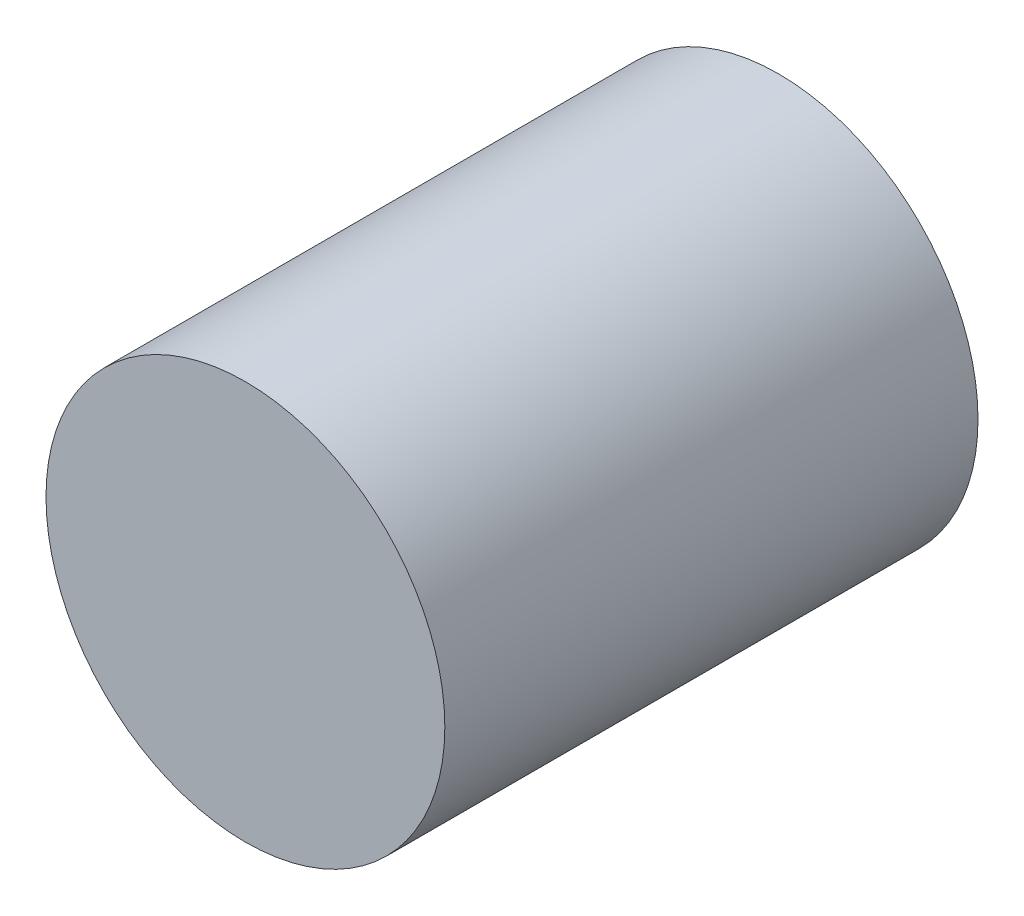
ISO-10303-21;
HEADER;
FILE_DESCRIPTION(('STEP AP214'),'2;1');
FILE_NAME('part.step','',(''),(''),'','','');
FILE_SCHEMA(('AUTOMOTIVE_DESIGN { 1 0 10303 214 1 1 1 1 }'));
ENDSEC;
DATA;
#1=APPLICATION_CONTEXT('core data for automotive mechanical design processes');
#2=APPLICATION_PROTOCOL_DEFINITION('international standard','automotive_design',2000,#1);
#3=PRODUCT_CONTEXT('',#1,'mechanical');
#4=PRODUCT('Part','Part','',(#3));
#5=PRODUCT_RELATED_PRODUCT_CATEGORY('part','',(#4));
#6=PRODUCT_DEFINITION_FORMATION('','',#4);
#7=PRODUCT_DEFINITION_CONTEXT('part definition',#1,'design');
#8=PRODUCT_DEFINITION('design','',#6,#7);
#9=PRODUCT_DEFINITION_SHAPE('','',#8);
#10=(LENGTH_UNIT() NAMED_UNIT(*) SI_UNIT(.MILLI.,.METRE.));
#11=(NAMED_UNIT(*) PLANE_ANGLE_UNIT() SI_UNIT($,.RADIAN.));
#12=(NAMED_UNIT(*) SI_UNIT($,.STERADIAN.) SOLID_ANGLE_UNIT());
#13=UNCERTAINTY_MEASURE_WITH_UNIT(LENGTH_MEASURE(1.E-05),#10,'distance_accuracy_value','');
#14=(GEOMETRIC_REPRESENTATION_CONTEXT(3) GLOBAL_UNCERTAINTY_ASSIGNED_CONTEXT((#13)) GLOBAL_UNIT_ASSIGNED_CONTEXT((#10,
#11,#12)) REPRESENTATION_CONTEXT('',''));
#15=CARTESIAN_POINT('',(0.,0.,0.));
#16=DIRECTION('',(0.,0.,1.));
#17=DIRECTION('',(1.,0.,0.));
#18=AXIS2_PLACEMENT_3D('',#15,#16,#17);
#19=CARTESIAN_POINT('',(0.,0.,12.7));
#20=DIRECTION('',(0.,0.,-1.));
#21=DIRECTION('',(-1.,0.,0.));
#22=AXIS2_PLACEMENT_3D('',#19,#20,#21);
#23=CYLINDRICAL_SURFACE('',#22,4.75);
#24=CARTESIAN_POINT('',(0.,0.,12.7));
#25=DIRECTION('',(0.,0.,1.));
#26=DIRECTION('',(1.,0.,0.));
#27=AXIS2_PLACEMENT_3D('',#24,#25,#26);
#28=CIRCLE('',#27,4.75);
#29=CARTESIAN_POINT('',(4.75,0.,12.7));
#30=VERTEX_POINT('',#29);
#31=EDGE_CURVE('E10',#30,#30,#28,.T.);
#32=ORIENTED_EDGE('',*,*,#31,.F.);
#33=EDGE_LOOP('',(#32));
#34=FACE_BOUND('',#33,.T.);
#35=CARTESIAN_POINT('',(0.,0.,0.));
#36=DIRECTION('',(0.,0.,1.));
#37=DIRECTION('',(1.,0.,0.));
#38=AXIS2_PLACEMENT_3D('',#35,#36,#37);
#39=CIRCLE('',#38,4.75);
#40=CARTESIAN_POINT('',(4.75,0.,0.));
#41=VERTEX_POINT('',#40);
#42=EDGE_CURVE('E39',#41,#41,#39,.T.);
#43=ORIENTED_EDGE('',*,*,#42,.T.);
#44=EDGE_LOOP('',(#43));
#45=FACE_BOUND('',#44,.T.);
#46=ADVANCED_FACE('F36',(#34,#45),#23,.T.);
#47=CARTESIAN_POINT('',(0.,0.,12.7));
#48=DIRECTION('',(0.,0.,1.));
#49=DIRECTION('',(1.,0.,0.));
#50=AXIS2_PLACEMENT_3D('',#47,#48,#49);
#51=PLANE('',#50);
#52=ORIENTED_EDGE('',*,*,#31,.T.);
#53=EDGE_LOOP('',(#52));
#54=FACE_BOUND('',#53,.T.);
#55=ADVANCED_FACE('F51',(#54),#51,.T.);
#56=CARTESIAN_POINT('',(0.,0.,0.));
#57=DIRECTION('',(0.,0.,1.));
#58=DIRECTION('',(1.,0.,0.));
#59=AXIS2_PLACEMENT_3D('',#56,#57,#58);
#60=PLANE('',#59);
#61=ORIENTED_EDGE('',*,*,#42,.F.);
#62=EDGE_LOOP('',(#61));
#63=FACE_BOUND('',#62,.T.);
#64=ADVANCED_FACE('F49',(#63),#60,.F.);
#65=CLOSED_SHELL('',(#46,#55,#64));
#66=MANIFOLD_SOLID_BREP('B2',#65);
#67=ADVANCED_BREP_SHAPE_REPRESENTATION('',(#18,#66),#14);
#68=SHAPE_DEFINITION_REPRESENTATION(#9,#67);
ENDSEC;
END-ISO-10303-21;
